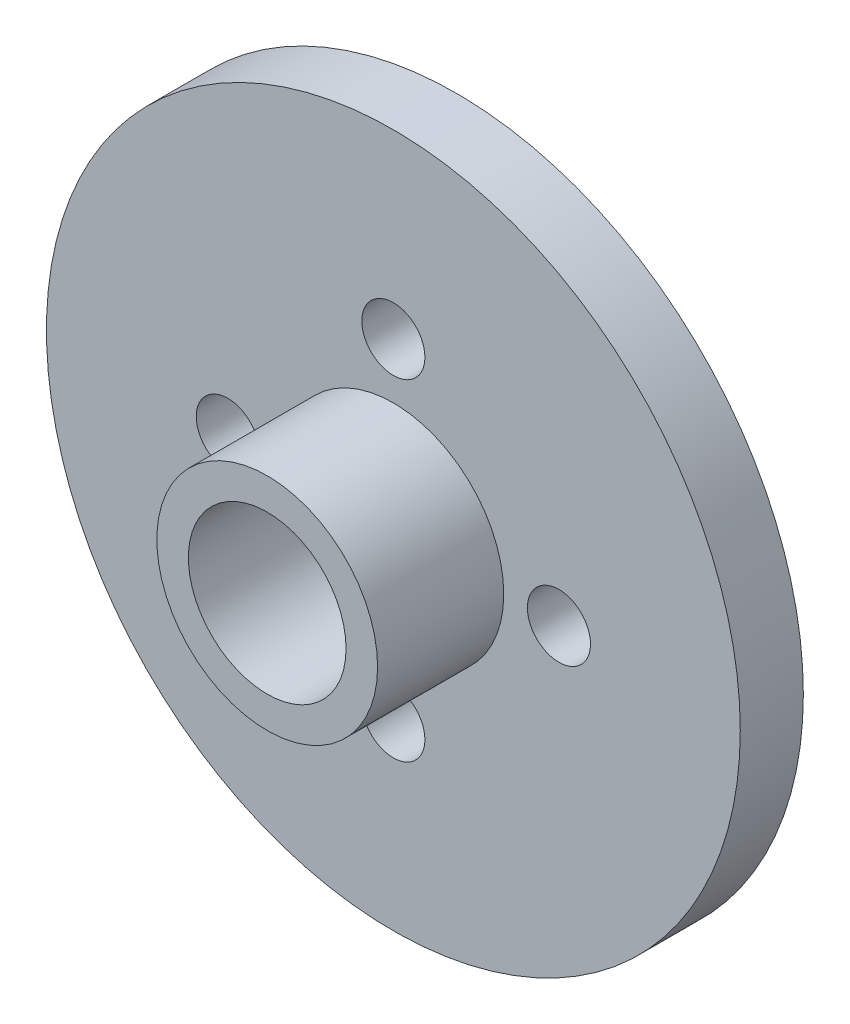
ISO-10303-21;
HEADER;
FILE_DESCRIPTION(('STEP AP214'),'2;1');
FILE_NAME('part.step','',(''),(''),'','','');
FILE_SCHEMA(('AUTOMOTIVE_DESIGN { 1 0 10303 214 1 1 1 1 }'));
ENDSEC;
DATA;
#1=APPLICATION_CONTEXT('core data for automotive mechanical design processes');
#2=APPLICATION_PROTOCOL_DEFINITION('international standard','automotive_design',2000,#1);
#3=PRODUCT_CONTEXT('',#1,'mechanical');
#4=PRODUCT('Part','Part','',(#3));
#5=PRODUCT_RELATED_PRODUCT_CATEGORY('part','',(#4));
#6=PRODUCT_DEFINITION_FORMATION('','',#4);
#7=PRODUCT_DEFINITION_CONTEXT('part definition',#1,'design');
#8=PRODUCT_DEFINITION('design','',#6,#7);
#9=PRODUCT_DEFINITION_SHAPE('','',#8);
#10=(LENGTH_UNIT() NAMED_UNIT(*) SI_UNIT(.MILLI.,.METRE.));
#11=(NAMED_UNIT(*) PLANE_ANGLE_UNIT() SI_UNIT($,.RADIAN.));
#12=(NAMED_UNIT(*) SI_UNIT($,.STERADIAN.) SOLID_ANGLE_UNIT());
#13=UNCERTAINTY_MEASURE_WITH_UNIT(LENGTH_MEASURE(1.E-05),#10,'distance_accuracy_value','');
#14=(GEOMETRIC_REPRESENTATION_CONTEXT(3) GLOBAL_UNCERTAINTY_ASSIGNED_CONTEXT((#13)) GLOBAL_UNIT_ASSIGNED_CONTEXT((#10,
#11,#12)) REPRESENTATION_CONTEXT('',''));
#15=CARTESIAN_POINT('',(0.,0.,0.));
#16=DIRECTION('',(0.,0.,1.));
#17=DIRECTION('',(1.,0.,0.));
#18=AXIS2_PLACEMENT_3D('',#15,#16,#17);
#19=CARTESIAN_POINT('',(0.,0.,2.));
#20=DIRECTION('',(0.,0.,1.));
#21=DIRECTION('',(1.,0.,0.));
#22=AXIS2_PLACEMENT_3D('',#19,#20,#21);
#23=PLANE('',#22);
#24=CARTESIAN_POINT('',(0.,5.25,2.));
#25=DIRECTION('',(0.,0.,1.));
#26=DIRECTION('',(1.,0.,0.));
#27=AXIS2_PLACEMENT_3D('',#24,#25,#26);
#28=CIRCLE('',#27,1.);
#29=CARTESIAN_POINT('',(1.,5.25,2.));
#30=VERTEX_POINT('',#29);
#31=EDGE_CURVE('E66',#30,#30,#28,.T.);
#32=ORIENTED_EDGE('',*,*,#31,.F.);
#33=EDGE_LOOP('',(#32));
#34=FACE_BOUND('',#33,.T.);
#35=CARTESIAN_POINT('',(0.,-5.25,2.));
#36=DIRECTION('',(0.,0.,1.));
#37=DIRECTION('',(1.,0.,0.));
#38=AXIS2_PLACEMENT_3D('',#35,#36,#37);
#39=CIRCLE('',#38,1.);
#40=CARTESIAN_POINT('',(0.999999999999999,-5.25,2.));
#41=VERTEX_POINT('',#40);
#42=EDGE_CURVE('E54',#41,#41,#39,.T.);
#43=ORIENTED_EDGE('',*,*,#42,.F.);
#44=EDGE_LOOP('',(#43));
#45=FACE_BOUND('',#44,.T.);
#46=CARTESIAN_POINT('',(0.,0.,2.));
#47=DIRECTION('',(0.,0.,1.));
#48=DIRECTION('',(1.,0.,0.));
#49=AXIS2_PLACEMENT_3D('',#46,#47,#48);
#50=CIRCLE('',#49,11.);
#51=CARTESIAN_POINT('',(11.,0.,2.));
#52=VERTEX_POINT('',#51);
#53=EDGE_CURVE('E10',#52,#52,#50,.T.);
#54=ORIENTED_EDGE('',*,*,#53,.T.);
#55=EDGE_LOOP('',(#54));
#56=FACE_BOUND('',#55,.T.);
#57=CARTESIAN_POINT('',(5.25,0.,2.));
#58=DIRECTION('',(0.,0.,1.));
#59=DIRECTION('',(1.,0.,0.));
#60=AXIS2_PLACEMENT_3D('',#57,#58,#59);
#61=CIRCLE('',#60,1.);
#62=CARTESIAN_POINT('',(6.25,0.,2.));
#63=VERTEX_POINT('',#62);
#64=EDGE_CURVE('E50',#63,#63,#61,.T.);
#65=ORIENTED_EDGE('',*,*,#64,.F.);
#66=EDGE_LOOP('',(#65));
#67=FACE_BOUND('',#66,.T.);
#68=CARTESIAN_POINT('',(-5.25,0.,2.));
#69=DIRECTION('',(0.,0.,1.));
#70=DIRECTION('',(1.,0.,0.));
#71=AXIS2_PLACEMENT_3D('',#68,#69,#70);
#72=CIRCLE('',#71,0.999999999999998);
#73=CARTESIAN_POINT('',(-4.25,0.,2.));
#74=VERTEX_POINT('',#73);
#75=EDGE_CURVE('E60',#74,#74,#72,.T.);
#76=ORIENTED_EDGE('',*,*,#75,.F.);
#77=EDGE_LOOP('',(#76));
#78=FACE_BOUND('',#77,.T.);
#79=CARTESIAN_POINT('',(0.,0.,2.));
#80=DIRECTION('',(0.,0.,1.));
#81=DIRECTION('',(1.,0.,0.));
#82=AXIS2_PLACEMENT_3D('',#79,#80,#81);
#83=CIRCLE('',#82,3.5);
#84=CARTESIAN_POINT('',(3.5,0.,2.));
#85=VERTEX_POINT('',#84);
#86=EDGE_CURVE('E75',#85,#85,#83,.T.);
#87=ORIENTED_EDGE('',*,*,#86,.F.);
#88=EDGE_LOOP('',(#87));
#89=FACE_BOUND('',#88,.T.);
#90=ADVANCED_FACE('F35',(#34,#45,#56,#67,#78,#89),#23,.T.);
#91=CARTESIAN_POINT('',(0.,0.,0.));
#92=DIRECTION('',(0.,0.,1.));
#93=DIRECTION('',(1.,0.,0.));
#94=AXIS2_PLACEMENT_3D('',#91,#92,#93);
#95=PLANE('',#94);
#96=CARTESIAN_POINT('',(0.,0.,0.));
#97=DIRECTION('',(0.,0.,1.));
#98=DIRECTION('',(1.,0.,0.));
#99=AXIS2_PLACEMENT_3D('',#96,#97,#98);
#100=CIRCLE('',#99,11.);
#101=CARTESIAN_POINT('',(11.,0.,0.));
#102=VERTEX_POINT('',#101);
#103=EDGE_CURVE('E39',#102,#102,#100,.T.);
#104=ORIENTED_EDGE('',*,*,#103,.F.);
#105=EDGE_LOOP('',(#104));
#106=FACE_BOUND('',#105,.T.);
#107=CARTESIAN_POINT('',(0.,0.,0.));
#108=DIRECTION('',(0.,0.,1.));
#109=DIRECTION('',(1.,0.,0.));
#110=AXIS2_PLACEMENT_3D('',#107,#108,#109);
#111=CIRCLE('',#110,2.5);
#112=CARTESIAN_POINT('',(2.5,0.,0.));
#113=VERTEX_POINT('',#112);
#114=EDGE_CURVE('E46',#113,#113,#111,.T.);
#115=ORIENTED_EDGE('',*,*,#114,.T.);
#116=EDGE_LOOP('',(#115));
#117=FACE_BOUND('',#116,.T.);
#118=CARTESIAN_POINT('',(5.25,0.,0.));
#119=DIRECTION('',(0.,0.,1.));
#120=DIRECTION('',(1.,0.,0.));
#121=AXIS2_PLACEMENT_3D('',#118,#119,#120);
#122=CIRCLE('',#121,1.);
#123=CARTESIAN_POINT('',(6.25,0.,0.));
#124=VERTEX_POINT('',#123);
#125=EDGE_CURVE('E51',#124,#124,#122,.T.);
#126=ORIENTED_EDGE('',*,*,#125,.T.);
#127=EDGE_LOOP('',(#126));
#128=FACE_BOUND('',#127,.T.);
#129=CARTESIAN_POINT('',(0.,-5.25,0.));
#130=DIRECTION('',(0.,0.,1.));
#131=DIRECTION('',(1.,0.,0.));
#132=AXIS2_PLACEMENT_3D('',#129,#130,#131);
#133=CIRCLE('',#132,1.);
#134=CARTESIAN_POINT('',(0.999999999999999,-5.25,0.));
#135=VERTEX_POINT('',#134);
#136=EDGE_CURVE('E57',#135,#135,#133,.T.);
#137=ORIENTED_EDGE('',*,*,#136,.T.);
#138=EDGE_LOOP('',(#137));
#139=FACE_BOUND('',#138,.T.);
#140=CARTESIAN_POINT('',(-5.25,0.,0.));
#141=DIRECTION('',(0.,0.,1.));
#142=DIRECTION('',(1.,0.,0.));
#143=AXIS2_PLACEMENT_3D('',#140,#141,#142);
#144=CIRCLE('',#143,0.999999999999998);
#145=CARTESIAN_POINT('',(-4.25,0.,0.));
#146=VERTEX_POINT('',#145);
#147=EDGE_CURVE('E63',#146,#146,#144,.T.);
#148=ORIENTED_EDGE('',*,*,#147,.T.);
#149=EDGE_LOOP('',(#148));
#150=FACE_BOUND('',#149,.T.);
#151=CARTESIAN_POINT('',(0.,5.25,0.));
#152=DIRECTION('',(0.,0.,1.));
#153=DIRECTION('',(1.,0.,0.));
#154=AXIS2_PLACEMENT_3D('',#151,#152,#153);
#155=CIRCLE('',#154,1.);
#156=CARTESIAN_POINT('',(1.,5.25,0.));
#157=VERTEX_POINT('',#156);
#158=EDGE_CURVE('E69',#157,#157,#155,.T.);
#159=ORIENTED_EDGE('',*,*,#158,.T.);
#160=EDGE_LOOP('',(#159));
#161=FACE_BOUND('',#160,.T.);
#162=ADVANCED_FACE('F102',(#106,#117,#128,#139,#150,#161),#95,.F.);
#163=CARTESIAN_POINT('',(0.,0.,2.));
#164=DIRECTION('',(0.,0.,-1.));
#165=DIRECTION('',(-1.,0.,0.));
#166=AXIS2_PLACEMENT_3D('',#163,#164,#165);
#167=CYLINDRICAL_SURFACE('',#166,11.);
#168=ORIENTED_EDGE('',*,*,#53,.F.);
#169=EDGE_LOOP('',(#168));
#170=FACE_BOUND('',#169,.T.);
#171=ORIENTED_EDGE('',*,*,#103,.T.);
#172=EDGE_LOOP('',(#171));
#173=FACE_BOUND('',#172,.T.);
#174=ADVANCED_FACE('F37',(#170,#173),#167,.T.);
#175=CARTESIAN_POINT('',(0.,0.,2.));
#176=DIRECTION('',(0.,0.,-1.));
#177=DIRECTION('',(-1.,0.,0.));
#178=AXIS2_PLACEMENT_3D('',#175,#176,#177);
#179=CYLINDRICAL_SURFACE('',#178,2.5);
#180=ORIENTED_EDGE('',*,*,#114,.F.);
#181=EDGE_LOOP('',(#180));
#182=FACE_BOUND('',#181,.T.);
#183=CARTESIAN_POINT('',(0.,0.,6.));
#184=DIRECTION('',(0.,0.,1.));
#185=DIRECTION('',(1.,0.,0.));
#186=AXIS2_PLACEMENT_3D('',#183,#184,#185);
#187=CIRCLE('',#186,2.5);
#188=CARTESIAN_POINT('',(2.5,0.,6.));
#189=VERTEX_POINT('',#188);
#190=EDGE_CURVE('E78',#189,#189,#187,.T.);
#191=ORIENTED_EDGE('',*,*,#190,.T.);
#192=EDGE_LOOP('',(#191));
#193=FACE_BOUND('',#192,.T.);
#194=ADVANCED_FACE('F84',(#182,#193),#179,.F.);
#195=CARTESIAN_POINT('',(5.25,0.,2.));
#196=DIRECTION('',(0.,0.,-1.));
#197=DIRECTION('',(-1.,0.,0.));
#198=AXIS2_PLACEMENT_3D('',#195,#196,#197);
#199=CYLINDRICAL_SURFACE('',#198,1.);
#200=ORIENTED_EDGE('',*,*,#64,.T.);
#201=EDGE_LOOP('',(#200));
#202=FACE_BOUND('',#201,.T.);
#203=ORIENTED_EDGE('',*,*,#125,.F.);
#204=EDGE_LOOP('',(#203));
#205=FACE_BOUND('',#204,.T.);
#206=ADVANCED_FACE('F114',(#202,#205),#199,.F.);
#207=CARTESIAN_POINT('',(0.,-5.25,2.));
#208=DIRECTION('',(0.,0.,-1.));
#209=DIRECTION('',(-1.,0.,0.));
#210=AXIS2_PLACEMENT_3D('',#207,#208,#209);
#211=CYLINDRICAL_SURFACE('',#210,1.);
#212=ORIENTED_EDGE('',*,*,#42,.T.);
#213=EDGE_LOOP('',(#212));
#214=FACE_BOUND('',#213,.T.);
#215=ORIENTED_EDGE('',*,*,#136,.F.);
#216=EDGE_LOOP('',(#215));
#217=FACE_BOUND('',#216,.T.);
#218=ADVANCED_FACE('F118',(#214,#217),#211,.F.);
#219=CARTESIAN_POINT('',(-5.25,0.,2.));
#220=DIRECTION('',(0.,0.,-1.));
#221=DIRECTION('',(-1.,0.,0.));
#222=AXIS2_PLACEMENT_3D('',#219,#220,#221);
#223=CYLINDRICAL_SURFACE('',#222,0.999999999999998);
#224=ORIENTED_EDGE('',*,*,#75,.T.);
#225=EDGE_LOOP('',(#224));
#226=FACE_BOUND('',#225,.T.);
#227=ORIENTED_EDGE('',*,*,#147,.F.);
#228=EDGE_LOOP('',(#227));
#229=FACE_BOUND('',#228,.T.);
#230=ADVANCED_FACE('F98',(#226,#229),#223,.F.);
#231=CARTESIAN_POINT('',(0.,5.25,2.));
#232=DIRECTION('',(0.,0.,-1.));
#233=DIRECTION('',(-1.,0.,0.));
#234=AXIS2_PLACEMENT_3D('',#231,#232,#233);
#235=CYLINDRICAL_SURFACE('',#234,1.);
#236=ORIENTED_EDGE('',*,*,#31,.T.);
#237=EDGE_LOOP('',(#236));
#238=FACE_BOUND('',#237,.T.);
#239=ORIENTED_EDGE('',*,*,#158,.F.);
#240=EDGE_LOOP('',(#239));
#241=FACE_BOUND('',#240,.T.);
#242=ADVANCED_FACE('F89',(#238,#241),#235,.F.);
#243=CARTESIAN_POINT('',(0.,0.,6.));
#244=DIRECTION('',(0.,0.,1.));
#245=DIRECTION('',(1.,0.,0.));
#246=AXIS2_PLACEMENT_3D('',#243,#244,#245);
#247=PLANE('',#246);
#248=CARTESIAN_POINT('',(0.,0.,6.));
#249=DIRECTION('',(0.,0.,1.));
#250=DIRECTION('',(1.,0.,0.));
#251=AXIS2_PLACEMENT_3D('',#248,#249,#250);
#252=CIRCLE('',#251,3.5);
#253=CARTESIAN_POINT('',(3.5,0.,6.));
#254=VERTEX_POINT('',#253);
#255=EDGE_CURVE('E72',#254,#254,#252,.T.);
#256=ORIENTED_EDGE('',*,*,#255,.T.);
#257=EDGE_LOOP('',(#256));
#258=FACE_BOUND('',#257,.T.);
#259=ORIENTED_EDGE('',*,*,#190,.F.);
#260=EDGE_LOOP('',(#259));
#261=FACE_BOUND('',#260,.T.);
#262=ADVANCED_FACE('F86',(#258,#261),#247,.T.);
#263=CARTESIAN_POINT('',(0.,0.,6.));
#264=DIRECTION('',(0.,0.,-1.));
#265=DIRECTION('',(-1.,0.,0.));
#266=AXIS2_PLACEMENT_3D('',#263,#264,#265);
#267=CYLINDRICAL_SURFACE('',#266,3.5);
#268=ORIENTED_EDGE('',*,*,#255,.F.);
#269=EDGE_LOOP('',(#268));
#270=FACE_BOUND('',#269,.T.);
#271=ORIENTED_EDGE('',*,*,#86,.T.);
#272=EDGE_LOOP('',(#271));
#273=FACE_BOUND('',#272,.T.);
#274=ADVANCED_FACE('F88',(#270,#273),#267,.T.);
#275=CLOSED_SHELL('',(#90,#162,#174,#194,#206,#218,#230,#242,#262,#274));
#276=MANIFOLD_SOLID_BREP('B2',#275);
#277=ADVANCED_BREP_SHAPE_REPRESENTATION('',(#18,#276),#14);
#278=SHAPE_DEFINITION_REPRESENTATION(#9,#277);
ENDSEC;
END-ISO-10303-21;
